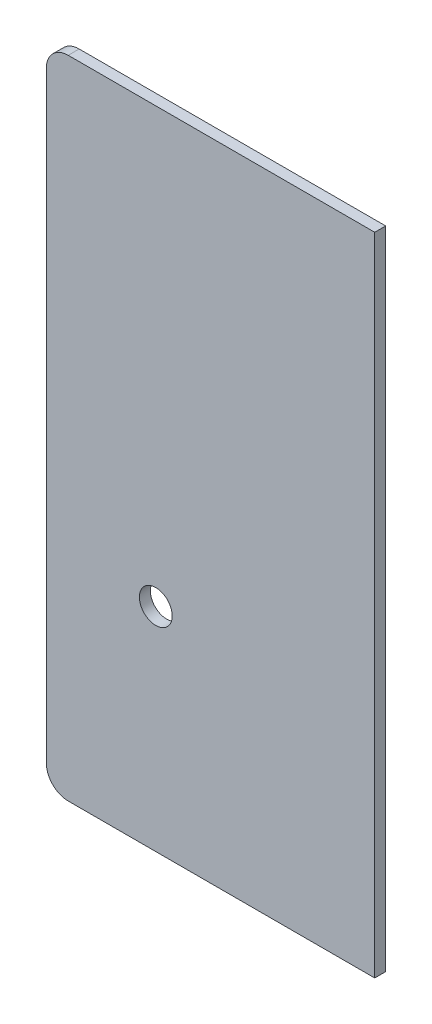
ISO-10303-21;
HEADER;
FILE_DESCRIPTION(('STEP AP214'),'2;1');
FILE_NAME('part.step','',(''),(''),'','','');
FILE_SCHEMA(('AUTOMOTIVE_DESIGN { 1 0 10303 214 1 1 1 1 }'));
ENDSEC;
DATA;
#1=APPLICATION_CONTEXT('core data for automotive mechanical design processes');
#2=APPLICATION_PROTOCOL_DEFINITION('international standard','automotive_design',2000,#1);
#3=PRODUCT_CONTEXT('',#1,'mechanical');
#4=PRODUCT('Part','Part','',(#3));
#5=PRODUCT_RELATED_PRODUCT_CATEGORY('part','',(#4));
#6=PRODUCT_DEFINITION_FORMATION('','',#4);
#7=PRODUCT_DEFINITION_CONTEXT('part definition',#1,'design');
#8=PRODUCT_DEFINITION('design','',#6,#7);
#9=PRODUCT_DEFINITION_SHAPE('','',#8);
#10=(LENGTH_UNIT() NAMED_UNIT(*) SI_UNIT(.MILLI.,.METRE.));
#11=(NAMED_UNIT(*) PLANE_ANGLE_UNIT() SI_UNIT($,.RADIAN.));
#12=(NAMED_UNIT(*) SI_UNIT($,.STERADIAN.) SOLID_ANGLE_UNIT());
#13=UNCERTAINTY_MEASURE_WITH_UNIT(LENGTH_MEASURE(1.E-05),#10,'distance_accuracy_value','');
#14=(GEOMETRIC_REPRESENTATION_CONTEXT(3) GLOBAL_UNCERTAINTY_ASSIGNED_CONTEXT((#13)) GLOBAL_UNIT_ASSIGNED_CONTEXT((#10,
#11,#12)) REPRESENTATION_CONTEXT('',''));
#15=CARTESIAN_POINT('',(0.,0.,0.));
#16=DIRECTION('',(0.,0.,1.));
#17=DIRECTION('',(1.,0.,0.));
#18=AXIS2_PLACEMENT_3D('',#15,#16,#17);
#19=CARTESIAN_POINT('',(-72.,47.75,1.));
#20=DIRECTION('',(0.,0.,1.));
#21=DIRECTION('',(1.,0.,0.));
#22=AXIS2_PLACEMENT_3D('',#19,#20,#21);
#23=PLANE('',#22);
#24=DIRECTION('',(1.,0.,0.));
#25=VECTOR('',#24,1.);
#26=CARTESIAN_POINT('',(-72.,-9.25,1.));
#27=LINE('',#26,#25);
#28=CARTESIAN_POINT('',(-72.,-9.25,1.));
#29=VERTEX_POINT('',#28);
#30=CARTESIAN_POINT('',(-44.,-9.25,1.));
#31=VERTEX_POINT('',#30);
#32=EDGE_CURVE('E132',#29,#31,#27,.T.);
#33=ORIENTED_EDGE('',*,*,#32,.T.);
#34=DIRECTION('',(0.,1.,0.));
#35=VECTOR('',#34,1.);
#36=CARTESIAN_POINT('',(-44.,49.75,1.));
#37=LINE('',#36,#35);
#38=CARTESIAN_POINT('',(-44.,49.75,1.));
#39=VERTEX_POINT('',#38);
#40=EDGE_CURVE('E90',#31,#39,#37,.T.);
#41=ORIENTED_EDGE('',*,*,#40,.T.);
#42=DIRECTION('',(-1.,0.,0.));
#43=VECTOR('',#42,1.);
#44=CARTESIAN_POINT('',(-72.,49.75,1.));
#45=LINE('',#44,#43);
#46=CARTESIAN_POINT('',(-72.,49.75,1.));
#47=VERTEX_POINT('',#46);
#48=EDGE_CURVE('E103',#39,#47,#45,.T.);
#49=ORIENTED_EDGE('',*,*,#48,.T.);
#50=CARTESIAN_POINT('',(-72.,47.75,1.));
#51=DIRECTION('',(0.,0.,1.));
#52=DIRECTION('',(1.,0.,0.));
#53=AXIS2_PLACEMENT_3D('',#50,#51,#52);
#54=CIRCLE('',#53,2.);
#55=CARTESIAN_POINT('',(-74.,47.75,1.));
#56=VERTEX_POINT('',#55);
#57=EDGE_CURVE('E97',#47,#56,#54,.T.);
#58=ORIENTED_EDGE('',*,*,#57,.T.);
#59=DIRECTION('',(0.,-1.,0.));
#60=VECTOR('',#59,1.);
#61=CARTESIAN_POINT('',(-74.,47.75,1.));
#62=LINE('',#61,#60);
#63=CARTESIAN_POINT('',(-74.,-7.24999999999999,1.));
#64=VERTEX_POINT('',#63);
#65=EDGE_CURVE('E101',#56,#64,#62,.T.);
#66=ORIENTED_EDGE('',*,*,#65,.T.);
#67=CARTESIAN_POINT('',(-72.,-7.25,1.));
#68=DIRECTION('',(0.,0.,1.));
#69=DIRECTION('',(-1.,0.,0.));
#70=AXIS2_PLACEMENT_3D('',#67,#68,#69);
#71=CIRCLE('',#70,2.);
#72=EDGE_CURVE('E53',#64,#29,#71,.T.);
#73=ORIENTED_EDGE('',*,*,#72,.T.);
#74=EDGE_LOOP('',(#33,#41,#49,#58,#66,#73));
#75=FACE_BOUND('',#74,.T.);
#76=CARTESIAN_POINT('',(-63.9999999999964,10.1400000000035,1.));
#77=DIRECTION('',(0.,0.,1.));
#78=DIRECTION('',(1.,0.,0.));
#79=AXIS2_PLACEMENT_3D('',#76,#77,#78);
#80=CIRCLE('',#79,1.5);
#81=CARTESIAN_POINT('',(-62.4999999999964,10.1400000000035,1.));
#82=VERTEX_POINT('',#81);
#83=EDGE_CURVE('E125',#82,#82,#80,.T.);
#84=ORIENTED_EDGE('',*,*,#83,.F.);
#85=EDGE_LOOP('',(#84));
#86=FACE_BOUND('',#85,.T.);
#87=ADVANCED_FACE('F36',(#75,#86),#23,.T.);
#88=CARTESIAN_POINT('',(-72.,47.75,0.));
#89=DIRECTION('',(0.,0.,1.));
#90=DIRECTION('',(1.,0.,0.));
#91=AXIS2_PLACEMENT_3D('',#88,#89,#90);
#92=PLANE('',#91);
#93=DIRECTION('',(1.,0.,0.));
#94=VECTOR('',#93,1.);
#95=CARTESIAN_POINT('',(-72.,-9.25,0.));
#96=LINE('',#95,#94);
#97=CARTESIAN_POINT('',(-72.,-9.25,0.));
#98=VERTEX_POINT('',#97);
#99=CARTESIAN_POINT('',(-44.,-9.25,0.));
#100=VERTEX_POINT('',#99);
#101=EDGE_CURVE('E121',#98,#100,#96,.T.);
#102=ORIENTED_EDGE('',*,*,#101,.F.);
#103=CARTESIAN_POINT('',(-72.,-7.25,0.));
#104=DIRECTION('',(0.,0.,1.));
#105=DIRECTION('',(-1.,0.,0.));
#106=AXIS2_PLACEMENT_3D('',#103,#104,#105);
#107=CIRCLE('',#106,2.);
#108=CARTESIAN_POINT('',(-74.,-7.24999999999999,0.));
#109=VERTEX_POINT('',#108);
#110=EDGE_CURVE('E82',#109,#98,#107,.T.);
#111=ORIENTED_EDGE('',*,*,#110,.F.);
#112=DIRECTION('',(0.,-1.,0.));
#113=VECTOR('',#112,1.);
#114=CARTESIAN_POINT('',(-74.,47.75,0.));
#115=LINE('',#114,#113);
#116=CARTESIAN_POINT('',(-74.,47.75,0.));
#117=VERTEX_POINT('',#116);
#118=EDGE_CURVE('E76',#117,#109,#115,.T.);
#119=ORIENTED_EDGE('',*,*,#118,.F.);
#120=CARTESIAN_POINT('',(-72.,47.75,0.));
#121=DIRECTION('',(0.,0.,1.));
#122=DIRECTION('',(1.,0.,0.));
#123=AXIS2_PLACEMENT_3D('',#120,#121,#122);
#124=CIRCLE('',#123,2.);
#125=CARTESIAN_POINT('',(-72.,49.75,0.));
#126=VERTEX_POINT('',#125);
#127=EDGE_CURVE('E111',#126,#117,#124,.T.);
#128=ORIENTED_EDGE('',*,*,#127,.F.);
#129=DIRECTION('',(-1.,0.,0.));
#130=VECTOR('',#129,1.);
#131=CARTESIAN_POINT('',(-72.,49.75,0.));
#132=LINE('',#131,#130);
#133=CARTESIAN_POINT('',(-44.,49.75,0.));
#134=VERTEX_POINT('',#133);
#135=EDGE_CURVE('E127',#134,#126,#132,.T.);
#136=ORIENTED_EDGE('',*,*,#135,.F.);
#137=DIRECTION('',(0.,1.,0.));
#138=VECTOR('',#137,1.);
#139=CARTESIAN_POINT('',(-44.,49.75,0.));
#140=LINE('',#139,#138);
#141=EDGE_CURVE('E124',#100,#134,#140,.T.);
#142=ORIENTED_EDGE('',*,*,#141,.F.);
#143=EDGE_LOOP('',(#102,#111,#119,#128,#136,#142));
#144=FACE_BOUND('',#143,.T.);
#145=CARTESIAN_POINT('',(-63.9999999999964,10.1400000000035,0.));
#146=DIRECTION('',(0.,0.,1.));
#147=DIRECTION('',(1.,0.,0.));
#148=AXIS2_PLACEMENT_3D('',#145,#146,#147);
#149=CIRCLE('',#148,1.5);
#150=CARTESIAN_POINT('',(-62.4999999999964,10.1400000000035,0.));
#151=VERTEX_POINT('',#150);
#152=EDGE_CURVE('E225',#151,#151,#149,.T.);
#153=ORIENTED_EDGE('',*,*,#152,.T.);
#154=EDGE_LOOP('',(#153));
#155=FACE_BOUND('',#154,.T.);
#156=ADVANCED_FACE('F141',(#144,#155),#92,.F.);
#157=CARTESIAN_POINT('',(-72.,-9.25,1.));
#158=DIRECTION('',(0.,1.,0.));
#159=DIRECTION('',(0.,0.,1.));
#160=AXIS2_PLACEMENT_3D('',#157,#158,#159);
#161=PLANE('',#160);
#162=ORIENTED_EDGE('',*,*,#101,.T.);
#163=DIRECTION('',(0.,0.,-1.));
#164=VECTOR('',#163,1.);
#165=CARTESIAN_POINT('',(-44.,-9.25,1.));
#166=LINE('',#165,#164);
#167=EDGE_CURVE('E11',#31,#100,#166,.T.);
#168=ORIENTED_EDGE('',*,*,#167,.F.);
#169=ORIENTED_EDGE('',*,*,#32,.F.);
#170=DIRECTION('',(0.,0.,-1.));
#171=VECTOR('',#170,1.);
#172=CARTESIAN_POINT('',(-72.,-9.25,1.));
#173=LINE('',#172,#171);
#174=EDGE_CURVE('E117',#29,#98,#173,.T.);
#175=ORIENTED_EDGE('',*,*,#174,.T.);
#176=EDGE_LOOP('',(#162,#168,#169,#175));
#177=FACE_BOUND('',#176,.T.);
#178=ADVANCED_FACE('F38',(#177),#161,.F.);
#179=CARTESIAN_POINT('',(-44.,49.75,1.));
#180=DIRECTION('',(-1.,0.,0.));
#181=DIRECTION('',(0.,-1.,0.));
#182=AXIS2_PLACEMENT_3D('',#179,#180,#181);
#183=PLANE('',#182);
#184=ORIENTED_EDGE('',*,*,#141,.T.);
#185=DIRECTION('',(0.,0.,-1.));
#186=VECTOR('',#185,1.);
#187=CARTESIAN_POINT('',(-44.,49.75,1.));
#188=LINE('',#187,#186);
#189=EDGE_CURVE('E45',#39,#134,#188,.T.);
#190=ORIENTED_EDGE('',*,*,#189,.F.);
#191=ORIENTED_EDGE('',*,*,#40,.F.);
#192=ORIENTED_EDGE('',*,*,#167,.T.);
#193=EDGE_LOOP('',(#184,#190,#191,#192));
#194=FACE_BOUND('',#193,.T.);
#195=ADVANCED_FACE('F166',(#194),#183,.F.);
#196=CARTESIAN_POINT('',(-72.,49.75,1.));
#197=DIRECTION('',(0.,-1.,0.));
#198=DIRECTION('',(1.,0.,0.));
#199=AXIS2_PLACEMENT_3D('',#196,#197,#198);
#200=PLANE('',#199);
#201=ORIENTED_EDGE('',*,*,#135,.T.);
#202=DIRECTION('',(0.,0.,-1.));
#203=VECTOR('',#202,1.);
#204=CARTESIAN_POINT('',(-72.,49.75,1.));
#205=LINE('',#204,#203);
#206=EDGE_CURVE('E112',#47,#126,#205,.T.);
#207=ORIENTED_EDGE('',*,*,#206,.F.);
#208=ORIENTED_EDGE('',*,*,#48,.F.);
#209=ORIENTED_EDGE('',*,*,#189,.T.);
#210=EDGE_LOOP('',(#201,#207,#208,#209));
#211=FACE_BOUND('',#210,.T.);
#212=ADVANCED_FACE('F138',(#211),#200,.F.);
#213=CARTESIAN_POINT('',(-72.,47.75,1.));
#214=DIRECTION('',(0.,0.,-1.));
#215=DIRECTION('',(-1.,0.,0.));
#216=AXIS2_PLACEMENT_3D('',#213,#214,#215);
#217=CYLINDRICAL_SURFACE('',#216,2.);
#218=ORIENTED_EDGE('',*,*,#127,.T.);
#219=DIRECTION('',(0.,0.,-1.));
#220=VECTOR('',#219,1.);
#221=CARTESIAN_POINT('',(-74.,47.75,1.));
#222=LINE('',#221,#220);
#223=EDGE_CURVE('E108',#56,#117,#222,.T.);
#224=ORIENTED_EDGE('',*,*,#223,.F.);
#225=ORIENTED_EDGE('',*,*,#57,.F.);
#226=ORIENTED_EDGE('',*,*,#206,.T.);
#227=EDGE_LOOP('',(#218,#224,#225,#226));
#228=FACE_BOUND('',#227,.T.);
#229=ADVANCED_FACE('F109',(#228),#217,.T.);
#230=CARTESIAN_POINT('',(-74.,47.75,1.));
#231=DIRECTION('',(1.,0.,0.));
#232=DIRECTION('',(0.,0.,-1.));
#233=AXIS2_PLACEMENT_3D('',#230,#231,#232);
#234=PLANE('',#233);
#235=ORIENTED_EDGE('',*,*,#118,.T.);
#236=DIRECTION('',(0.,0.,-1.));
#237=VECTOR('',#236,1.);
#238=CARTESIAN_POINT('',(-74.,-7.24999999999999,1.));
#239=LINE('',#238,#237);
#240=EDGE_CURVE('E113',#64,#109,#239,.T.);
#241=ORIENTED_EDGE('',*,*,#240,.F.);
#242=ORIENTED_EDGE('',*,*,#65,.F.);
#243=ORIENTED_EDGE('',*,*,#223,.T.);
#244=EDGE_LOOP('',(#235,#241,#242,#243));
#245=FACE_BOUND('',#244,.T.);
#246=ADVANCED_FACE('F115',(#245),#234,.F.);
#247=CARTESIAN_POINT('',(-72.,-7.25,1.));
#248=DIRECTION('',(0.,0.,-1.));
#249=DIRECTION('',(-1.,0.,0.));
#250=AXIS2_PLACEMENT_3D('',#247,#248,#249);
#251=CYLINDRICAL_SURFACE('',#250,2.);
#252=ORIENTED_EDGE('',*,*,#110,.T.);
#253=ORIENTED_EDGE('',*,*,#174,.F.);
#254=ORIENTED_EDGE('',*,*,#72,.F.);
#255=ORIENTED_EDGE('',*,*,#240,.T.);
#256=EDGE_LOOP('',(#252,#253,#254,#255));
#257=FACE_BOUND('',#256,.T.);
#258=ADVANCED_FACE('F146',(#257),#251,.T.);
#259=CARTESIAN_POINT('',(-63.9999999999964,10.1400000000035,1.));
#260=DIRECTION('',(0.,0.,-1.));
#261=DIRECTION('',(-1.,0.,0.));
#262=AXIS2_PLACEMENT_3D('',#259,#260,#261);
#263=CYLINDRICAL_SURFACE('',#262,1.5);
#264=ORIENTED_EDGE('',*,*,#83,.T.);
#265=EDGE_LOOP('',(#264));
#266=FACE_BOUND('',#265,.T.);
#267=ORIENTED_EDGE('',*,*,#152,.F.);
#268=EDGE_LOOP('',(#267));
#269=FACE_BOUND('',#268,.T.);
#270=ADVANCED_FACE('F148',(#266,#269),#263,.F.);
#271=CLOSED_SHELL('',(#87,#156,#178,#195,#212,#229,#246,#258,#270));
#272=MANIFOLD_SOLID_BREP('B2',#271);
#273=ADVANCED_BREP_SHAPE_REPRESENTATION('',(#18,#272),#14);
#274=SHAPE_DEFINITION_REPRESENTATION(#9,#273);
ENDSEC;
END-ISO-10303-21;
